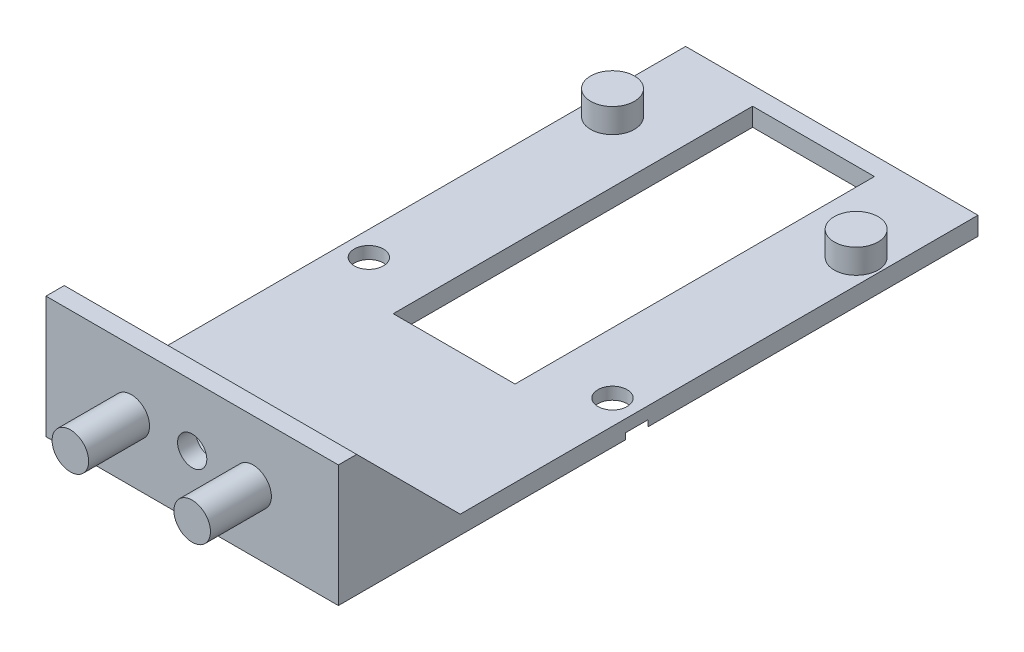
ISO-10303-21;
HEADER;
FILE_DESCRIPTION(('STEP AP214'),'2;1');
FILE_NAME('part.step','',(''),(''),'','','');
FILE_SCHEMA(('AUTOMOTIVE_DESIGN { 1 0 10303 214 1 1 1 1 }'));
ENDSEC;
DATA;
#1=APPLICATION_CONTEXT('core data for automotive mechanical design processes');
#2=APPLICATION_PROTOCOL_DEFINITION('international standard','automotive_design',2000,#1);
#3=PRODUCT_CONTEXT('',#1,'mechanical');
#4=PRODUCT('Part','Part','',(#3));
#5=PRODUCT_RELATED_PRODUCT_CATEGORY('part','',(#4));
#6=PRODUCT_DEFINITION_FORMATION('','',#4);
#7=PRODUCT_DEFINITION_CONTEXT('part definition',#1,'design');
#8=PRODUCT_DEFINITION('design','',#6,#7);
#9=PRODUCT_DEFINITION_SHAPE('','',#8);
#10=(LENGTH_UNIT() NAMED_UNIT(*) SI_UNIT(.MILLI.,.METRE.));
#11=(NAMED_UNIT(*) PLANE_ANGLE_UNIT() SI_UNIT($,.RADIAN.));
#12=(NAMED_UNIT(*) SI_UNIT($,.STERADIAN.) SOLID_ANGLE_UNIT());
#13=UNCERTAINTY_MEASURE_WITH_UNIT(LENGTH_MEASURE(1.E-05),#10,'distance_accuracy_value','');
#14=(GEOMETRIC_REPRESENTATION_CONTEXT(3) GLOBAL_UNCERTAINTY_ASSIGNED_CONTEXT((#13)) GLOBAL_UNIT_ASSIGNED_CONTEXT((#10,
#11,#12)) REPRESENTATION_CONTEXT('',''));
#15=CARTESIAN_POINT('',(0.,0.,0.));
#16=DIRECTION('',(0.,0.,1.));
#17=DIRECTION('',(1.,0.,0.));
#18=AXIS2_PLACEMENT_3D('',#15,#16,#17);
#19=CARTESIAN_POINT('',(12.,10.,32.));
#20=DIRECTION('',(0.,0.,1.));
#21=DIRECTION('',(1.,0.,0.));
#22=AXIS2_PLACEMENT_3D('',#19,#20,#21);
#23=PLANE('',#22);
#24=CARTESIAN_POINT('',(0.,5.,32.));
#25=DIRECTION('',(0.,0.,1.));
#26=DIRECTION('',(1.,0.,0.));
#27=AXIS2_PLACEMENT_3D('',#24,#25,#26);
#28=CIRCLE('',#27,1.2);
#29=CARTESIAN_POINT('',(1.2,5.,32.));
#30=VERTEX_POINT('',#29);
#31=EDGE_CURVE('E38',#30,#30,#28,.T.);
#32=ORIENTED_EDGE('',*,*,#31,.T.);
#33=EDGE_LOOP('',(#32));
#34=FACE_BOUND('',#33,.T.);
#35=DIRECTION('',(0.,1.,0.));
#36=VECTOR('',#35,1.);
#37=CARTESIAN_POINT('',(11.,10.,32.));
#38=LINE('',#37,#36);
#39=CARTESIAN_POINT('',(11.,1.5,32.));
#40=VERTEX_POINT('',#39);
#41=CARTESIAN_POINT('',(11.,10.,32.));
#42=VERTEX_POINT('',#41);
#43=EDGE_CURVE('E165',#40,#42,#38,.T.);
#44=ORIENTED_EDGE('',*,*,#43,.F.);
#45=DIRECTION('',(-1.,0.,0.));
#46=VECTOR('',#45,1.);
#47=CARTESIAN_POINT('',(12.,1.5,32.));
#48=LINE('',#47,#46);
#49=CARTESIAN_POINT('',(-11.,1.5,32.));
#50=VERTEX_POINT('',#49);
#51=EDGE_CURVE('E171',#40,#50,#48,.T.);
#52=ORIENTED_EDGE('',*,*,#51,.T.);
#53=DIRECTION('',(0.,-1.,0.));
#54=VECTOR('',#53,1.);
#55=CARTESIAN_POINT('',(-11.,10.,32.));
#56=LINE('',#55,#54);
#57=CARTESIAN_POINT('',(-11.,10.,32.));
#58=VERTEX_POINT('',#57);
#59=EDGE_CURVE('E178',#58,#50,#56,.T.);
#60=ORIENTED_EDGE('',*,*,#59,.F.);
#61=DIRECTION('',(-1.,0.,0.));
#62=VECTOR('',#61,1.);
#63=CARTESIAN_POINT('',(12.,10.,32.));
#64=LINE('',#63,#62);
#65=EDGE_CURVE('E211',#42,#58,#64,.T.);
#66=ORIENTED_EDGE('',*,*,#65,.F.);
#67=EDGE_LOOP('',(#44,#52,#60,#66));
#68=FACE_BOUND('',#67,.T.);
#69=ADVANCED_FACE('F34',(#34,#68),#23,.F.);
#70=CARTESIAN_POINT('',(0.,1.5,0.));
#71=DIRECTION('',(0.,-1.,0.));
#72=DIRECTION('',(0.,0.,-1.));
#73=AXIS2_PLACEMENT_3D('',#70,#71,#72);
#74=PLANE('',#73);
#75=DIRECTION('',(0.,0.,-1.));
#76=VECTOR('',#75,1.);
#77=CARTESIAN_POINT('',(5.,1.5,12.));
#78=LINE('',#77,#76);
#79=CARTESIAN_POINT('',(5.,1.5,12.));
#80=VERTEX_POINT('',#79);
#81=CARTESIAN_POINT('',(5.,1.5,-17.5));
#82=VERTEX_POINT('',#81);
#83=EDGE_CURVE('E258',#80,#82,#78,.T.);
#84=ORIENTED_EDGE('',*,*,#83,.F.);
#85=DIRECTION('',(1.,0.,0.));
#86=VECTOR('',#85,1.);
#87=CARTESIAN_POINT('',(-5.,1.5,12.));
#88=LINE('',#87,#86);
#89=CARTESIAN_POINT('',(-5.,1.5,12.));
#90=VERTEX_POINT('',#89);
#91=EDGE_CURVE('E266',#90,#80,#88,.T.);
#92=ORIENTED_EDGE('',*,*,#91,.F.);
#93=DIRECTION('',(0.,0.,1.));
#94=VECTOR('',#93,1.);
#95=CARTESIAN_POINT('',(-5.,1.5,12.));
#96=LINE('',#95,#94);
#97=CARTESIAN_POINT('',(-5.,1.5,-17.5));
#98=VERTEX_POINT('',#97);
#99=EDGE_CURVE('E263',#98,#90,#96,.T.);
#100=ORIENTED_EDGE('',*,*,#99,.F.);
#101=DIRECTION('',(-1.,0.,0.));
#102=VECTOR('',#101,1.);
#103=CARTESIAN_POINT('',(-5.,1.5,-17.5));
#104=LINE('',#103,#102);
#105=EDGE_CURVE('E260',#82,#98,#104,.T.);
#106=ORIENTED_EDGE('',*,*,#105,.F.);
#107=EDGE_LOOP('',(#84,#92,#100,#106));
#108=FACE_BOUND('',#107,.T.);
#109=CARTESIAN_POINT('',(10.,1.5,8.99999999999999));
#110=DIRECTION('',(0.,1.,0.));
#111=DIRECTION('',(0.,0.,1.));
#112=AXIS2_PLACEMENT_3D('',#109,#110,#111);
#113=CIRCLE('',#112,1.2);
#114=CARTESIAN_POINT('',(10.,1.5,10.2));
#115=VERTEX_POINT('',#114);
#116=EDGE_CURVE('E254',#115,#115,#113,.T.);
#117=ORIENTED_EDGE('',*,*,#116,.F.);
#118=EDGE_LOOP('',(#117));
#119=FACE_BOUND('',#118,.T.);
#120=CARTESIAN_POINT('',(10.,1.5,-11.));
#121=DIRECTION('',(0.,-1.,0.));
#122=DIRECTION('',(0.,0.,-1.));
#123=AXIS2_PLACEMENT_3D('',#120,#121,#122);
#124=CIRCLE('',#123,1.8);
#125=CARTESIAN_POINT('',(10.,1.5,-12.8));
#126=VERTEX_POINT('',#125);
#127=EDGE_CURVE('E310',#126,#126,#124,.F.);
#128=ORIENTED_EDGE('',*,*,#127,.F.);
#129=EDGE_LOOP('',(#128));
#130=FACE_BOUND('',#129,.T.);
#131=CARTESIAN_POINT('',(-10.,1.5,8.99999999999999));
#132=DIRECTION('',(0.,-1.,0.));
#133=DIRECTION('',(0.,0.,1.));
#134=AXIS2_PLACEMENT_3D('',#131,#132,#133);
#135=CIRCLE('',#134,1.2);
#136=CARTESIAN_POINT('',(-10.,1.5,10.2));
#137=VERTEX_POINT('',#136);
#138=EDGE_CURVE('E236',#137,#137,#135,.T.);
#139=ORIENTED_EDGE('',*,*,#138,.T.);
#140=EDGE_LOOP('',(#139));
#141=FACE_BOUND('',#140,.T.);
#142=CARTESIAN_POINT('',(-10.,1.5,-11.));
#143=DIRECTION('',(0.,-1.,0.));
#144=DIRECTION('',(0.,0.,1.));
#145=AXIS2_PLACEMENT_3D('',#142,#143,#144);
#146=CIRCLE('',#145,1.8);
#147=CARTESIAN_POINT('',(-10.,1.5,-9.20000000000001));
#148=VERTEX_POINT('',#147);
#149=EDGE_CURVE('E232',#148,#148,#146,.T.);
#150=ORIENTED_EDGE('',*,*,#149,.T.);
#151=EDGE_LOOP('',(#150));
#152=FACE_BOUND('',#151,.T.);
#153=DIRECTION('',(0.,0.,1.));
#154=VECTOR('',#153,1.);
#155=CARTESIAN_POINT('',(11.,1.5,0.));
#156=LINE('',#155,#154);
#157=CARTESIAN_POINT('',(11.,1.5,23.5));
#158=VERTEX_POINT('',#157);
#159=EDGE_CURVE('E160',#158,#40,#156,.T.);
#160=ORIENTED_EDGE('',*,*,#159,.F.);
#161=DIRECTION('',(-1.,0.,0.));
#162=VECTOR('',#161,1.);
#163=CARTESIAN_POINT('',(0.,1.5,23.5));
#164=LINE('',#163,#162);
#165=CARTESIAN_POINT('',(12.,1.5,23.5));
#166=VERTEX_POINT('',#165);
#167=EDGE_CURVE('E152',#158,#166,#164,.F.);
#168=ORIENTED_EDGE('',*,*,#167,.T.);
#169=DIRECTION('',(0.,0.,-1.));
#170=VECTOR('',#169,1.);
#171=CARTESIAN_POINT('',(12.,1.5,19.));
#172=LINE('',#171,#170);
#173=CARTESIAN_POINT('',(12.,1.5,-19.));
#174=VERTEX_POINT('',#173);
#175=EDGE_CURVE('E289',#166,#174,#172,.T.);
#176=ORIENTED_EDGE('',*,*,#175,.T.);
#177=DIRECTION('',(-1.,0.,0.));
#178=VECTOR('',#177,1.);
#179=CARTESIAN_POINT('',(-12.,1.5,-19.));
#180=LINE('',#179,#178);
#181=CARTESIAN_POINT('',(-12.,1.5,-19.));
#182=VERTEX_POINT('',#181);
#183=EDGE_CURVE('E291',#174,#182,#180,.T.);
#184=ORIENTED_EDGE('',*,*,#183,.T.);
#185=DIRECTION('',(0.,0.,1.));
#186=VECTOR('',#185,1.);
#187=CARTESIAN_POINT('',(-12.,1.5,19.));
#188=LINE('',#187,#186);
#189=CARTESIAN_POINT('',(-12.,1.5,23.5));
#190=VERTEX_POINT('',#189);
#191=EDGE_CURVE('E294',#182,#190,#188,.T.);
#192=ORIENTED_EDGE('',*,*,#191,.T.);
#193=DIRECTION('',(1.,0.,0.));
#194=VECTOR('',#193,1.);
#195=CARTESIAN_POINT('',(0.,1.5,23.5));
#196=LINE('',#195,#194);
#197=CARTESIAN_POINT('',(-11.,1.5,23.5));
#198=VERTEX_POINT('',#197);
#199=EDGE_CURVE('E185',#190,#198,#196,.T.);
#200=ORIENTED_EDGE('',*,*,#199,.T.);
#201=DIRECTION('',(0.,0.,-1.));
#202=VECTOR('',#201,1.);
#203=CARTESIAN_POINT('',(-11.,1.5,0.));
#204=LINE('',#203,#202);
#205=EDGE_CURVE('E183',#50,#198,#204,.T.);
#206=ORIENTED_EDGE('',*,*,#205,.F.);
#207=ORIENTED_EDGE('',*,*,#51,.F.);
#208=EDGE_LOOP('',(#160,#168,#176,#184,#192,#200,#206,#207));
#209=FACE_BOUND('',#208,.T.);
#210=ADVANCED_FACE('F169',(#108,#119,#130,#141,#152,#209),#74,.F.);
#211=CARTESIAN_POINT('',(12.,1.5,19.));
#212=DIRECTION('',(-1.,0.,0.));
#213=DIRECTION('',(0.,0.,1.));
#214=AXIS2_PLACEMENT_3D('',#211,#212,#213);
#215=PLANE('',#214);
#216=ORIENTED_EDGE('',*,*,#175,.F.);
#217=DIRECTION('',(0.,-0.707106781186546,-0.707106781186549));
#218=VECTOR('',#217,1.);
#219=CARTESIAN_POINT('',(12.,10.,32.));
#220=LINE('',#219,#218);
#221=CARTESIAN_POINT('',(12.,10.,32.));
#222=VERTEX_POINT('',#221);
#223=EDGE_CURVE('E155',#222,#166,#220,.T.);
#224=ORIENTED_EDGE('',*,*,#223,.F.);
#225=DIRECTION('',(0.,0.,-1.));
#226=VECTOR('',#225,1.);
#227=CARTESIAN_POINT('',(12.,10.,33.5));
#228=LINE('',#227,#226);
#229=CARTESIAN_POINT('',(12.,10.,33.5));
#230=VERTEX_POINT('',#229);
#231=EDGE_CURVE('E203',#230,#222,#228,.T.);
#232=ORIENTED_EDGE('',*,*,#231,.F.);
#233=DIRECTION('',(0.,-1.,0.));
#234=VECTOR('',#233,1.);
#235=CARTESIAN_POINT('',(12.,29.5401497856199,33.5));
#236=LINE('',#235,#234);
#237=CARTESIAN_POINT('',(12.,0.,33.5));
#238=VERTEX_POINT('',#237);
#239=EDGE_CURVE('E219',#230,#238,#236,.T.);
#240=ORIENTED_EDGE('',*,*,#239,.T.);
#241=DIRECTION('',(0.,0.,-1.));
#242=VECTOR('',#241,1.);
#243=CARTESIAN_POINT('',(12.,0.,19.));
#244=LINE('',#243,#242);
#245=CARTESIAN_POINT('',(12.,0.,9.91651513899116));
#246=VERTEX_POINT('',#245);
#247=EDGE_CURVE('E298',#238,#246,#244,.T.);
#248=ORIENTED_EDGE('',*,*,#247,.T.);
#249=DIRECTION('',(0.,-1.,0.));
#250=VECTOR('',#249,1.);
#251=CARTESIAN_POINT('',(12.,0.5,9.91651513899116));
#252=LINE('',#251,#250);
#253=CARTESIAN_POINT('',(12.,0.5,9.91651513899116));
#254=VERTEX_POINT('',#253);
#255=EDGE_CURVE('E313',#254,#246,#252,.T.);
#256=ORIENTED_EDGE('',*,*,#255,.F.);
#257=DIRECTION('',(0.,0.,-1.));
#258=VECTOR('',#257,1.);
#259=CARTESIAN_POINT('',(12.,0.5,19.));
#260=LINE('',#259,#258);
#261=CARTESIAN_POINT('',(12.,0.5,8.08348486100883));
#262=VERTEX_POINT('',#261);
#263=EDGE_CURVE('E248',#254,#262,#260,.T.);
#264=ORIENTED_EDGE('',*,*,#263,.T.);
#265=DIRECTION('',(0.,-1.,0.));
#266=VECTOR('',#265,1.);
#267=CARTESIAN_POINT('',(12.,0.5,8.08348486100883));
#268=LINE('',#267,#266);
#269=CARTESIAN_POINT('',(12.,0.,8.08348486100883));
#270=VERTEX_POINT('',#269);
#271=EDGE_CURVE('E318',#270,#262,#268,.F.);
#272=ORIENTED_EDGE('',*,*,#271,.F.);
#273=CARTESIAN_POINT('',(12.,0.,-19.));
#274=VERTEX_POINT('',#273);
#275=EDGE_CURVE('E288',#270,#274,#244,.T.);
#276=ORIENTED_EDGE('',*,*,#275,.T.);
#277=DIRECTION('',(0.,-1.,0.));
#278=VECTOR('',#277,1.);
#279=CARTESIAN_POINT('',(12.,1.5,-19.));
#280=LINE('',#279,#278);
#281=EDGE_CURVE('E307',#174,#274,#280,.T.);
#282=ORIENTED_EDGE('',*,*,#281,.F.);
#283=EDGE_LOOP('',(#216,#224,#232,#240,#248,#256,#264,#272,#276,#282));
#284=FACE_BOUND('',#283,.T.);
#285=ADVANCED_FACE('F36',(#284),#215,.F.);
#286=CARTESIAN_POINT('',(0.,0.,0.));
#287=DIRECTION('',(0.,-1.,0.));
#288=DIRECTION('',(0.,0.,-1.));
#289=AXIS2_PLACEMENT_3D('',#286,#287,#288);
#290=PLANE('',#289);
#291=CARTESIAN_POINT('',(10.,0.,8.99999999999999));
#292=DIRECTION('',(0.,1.,0.));
#293=DIRECTION('',(0.,0.,1.));
#294=AXIS2_PLACEMENT_3D('',#291,#292,#293);
#295=CIRCLE('',#294,2.2);
#296=EDGE_CURVE('E241',#270,#246,#295,.T.);
#297=ORIENTED_EDGE('',*,*,#296,.T.);
#298=ORIENTED_EDGE('',*,*,#247,.F.);
#299=DIRECTION('',(-1.,0.,0.));
#300=VECTOR('',#299,1.);
#301=CARTESIAN_POINT('',(12.,0.,33.5));
#302=LINE('',#301,#300);
#303=CARTESIAN_POINT('',(-12.,0.,33.5));
#304=VERTEX_POINT('',#303);
#305=EDGE_CURVE('E216',#238,#304,#302,.T.);
#306=ORIENTED_EDGE('',*,*,#305,.T.);
#307=DIRECTION('',(0.,0.,1.));
#308=VECTOR('',#307,1.);
#309=CARTESIAN_POINT('',(-12.,0.,19.));
#310=LINE('',#309,#308);
#311=CARTESIAN_POINT('',(-12.,0.,9.91651513899117));
#312=VERTEX_POINT('',#311);
#313=EDGE_CURVE('E302',#312,#304,#310,.T.);
#314=ORIENTED_EDGE('',*,*,#313,.F.);
#315=CARTESIAN_POINT('',(-10.,0.,8.99999999999999));
#316=DIRECTION('',(0.,-1.,0.));
#317=DIRECTION('',(0.,0.,1.));
#318=AXIS2_PLACEMENT_3D('',#315,#316,#317);
#319=CIRCLE('',#318,2.2);
#320=CARTESIAN_POINT('',(-12.,0.,8.08348486100881));
#321=VERTEX_POINT('',#320);
#322=EDGE_CURVE('E223',#321,#312,#319,.T.);
#323=ORIENTED_EDGE('',*,*,#322,.F.);
#324=CARTESIAN_POINT('',(-12.,0.,-19.));
#325=VERTEX_POINT('',#324);
#326=EDGE_CURVE('E292',#325,#321,#310,.T.);
#327=ORIENTED_EDGE('',*,*,#326,.F.);
#328=DIRECTION('',(-1.,0.,0.));
#329=VECTOR('',#328,1.);
#330=CARTESIAN_POINT('',(-12.,0.,-19.));
#331=LINE('',#330,#329);
#332=EDGE_CURVE('E300',#274,#325,#331,.T.);
#333=ORIENTED_EDGE('',*,*,#332,.F.);
#334=ORIENTED_EDGE('',*,*,#275,.F.);
#335=EDGE_LOOP('',(#297,#298,#306,#314,#323,#327,#333,#334));
#336=FACE_BOUND('',#335,.T.);
#337=DIRECTION('',(1.,0.,0.));
#338=VECTOR('',#337,1.);
#339=CARTESIAN_POINT('',(-5.,0.,12.));
#340=LINE('',#339,#338);
#341=CARTESIAN_POINT('',(-5.,0.,12.));
#342=VERTEX_POINT('',#341);
#343=CARTESIAN_POINT('',(5.,0.,12.));
#344=VERTEX_POINT('',#343);
#345=EDGE_CURVE('E261',#342,#344,#340,.T.);
#346=ORIENTED_EDGE('',*,*,#345,.T.);
#347=DIRECTION('',(0.,0.,-1.));
#348=VECTOR('',#347,1.);
#349=CARTESIAN_POINT('',(5.,0.,12.));
#350=LINE('',#349,#348);
#351=CARTESIAN_POINT('',(5.,0.,-17.5));
#352=VERTEX_POINT('',#351);
#353=EDGE_CURVE('E257',#344,#352,#350,.T.);
#354=ORIENTED_EDGE('',*,*,#353,.T.);
#355=DIRECTION('',(-1.,0.,0.));
#356=VECTOR('',#355,1.);
#357=CARTESIAN_POINT('',(-5.,0.,-17.5));
#358=LINE('',#357,#356);
#359=CARTESIAN_POINT('',(-5.,0.,-17.5));
#360=VERTEX_POINT('',#359);
#361=EDGE_CURVE('E271',#352,#360,#358,.T.);
#362=ORIENTED_EDGE('',*,*,#361,.T.);
#363=DIRECTION('',(0.,0.,1.));
#364=VECTOR('',#363,1.);
#365=CARTESIAN_POINT('',(-5.,0.,12.));
#366=LINE('',#365,#364);
#367=EDGE_CURVE('E274',#360,#342,#366,.T.);
#368=ORIENTED_EDGE('',*,*,#367,.T.);
#369=EDGE_LOOP('',(#346,#354,#362,#368));
#370=FACE_BOUND('',#369,.T.);
#371=ADVANCED_FACE('F332',(#336,#370),#290,.T.);
#372=CARTESIAN_POINT('',(-12.,1.5,-19.));
#373=DIRECTION('',(0.,0.,1.));
#374=DIRECTION('',(1.,0.,0.));
#375=AXIS2_PLACEMENT_3D('',#372,#373,#374);
#376=PLANE('',#375);
#377=ORIENTED_EDGE('',*,*,#332,.T.);
#378=DIRECTION('',(0.,-1.,0.));
#379=VECTOR('',#378,1.);
#380=CARTESIAN_POINT('',(-12.,1.5,-19.));
#381=LINE('',#380,#379);
#382=EDGE_CURVE('E297',#182,#325,#381,.T.);
#383=ORIENTED_EDGE('',*,*,#382,.F.);
#384=ORIENTED_EDGE('',*,*,#183,.F.);
#385=ORIENTED_EDGE('',*,*,#281,.T.);
#386=EDGE_LOOP('',(#377,#383,#384,#385));
#387=FACE_BOUND('',#386,.T.);
#388=ADVANCED_FACE('F354',(#387),#376,.F.);
#389=CARTESIAN_POINT('',(-12.,1.5,19.));
#390=DIRECTION('',(1.,0.,0.));
#391=DIRECTION('',(0.,0.,-1.));
#392=AXIS2_PLACEMENT_3D('',#389,#390,#391);
#393=PLANE('',#392);
#394=DIRECTION('',(0.,-0.707106781186546,-0.707106781186549));
#395=VECTOR('',#394,1.);
#396=CARTESIAN_POINT('',(-12.,10.,32.));
#397=LINE('',#396,#395);
#398=CARTESIAN_POINT('',(-12.,10.,32.));
#399=VERTEX_POINT('',#398);
#400=EDGE_CURVE('E175',#399,#190,#397,.T.);
#401=ORIENTED_EDGE('',*,*,#400,.T.);
#402=ORIENTED_EDGE('',*,*,#191,.F.);
#403=ORIENTED_EDGE('',*,*,#382,.T.);
#404=ORIENTED_EDGE('',*,*,#326,.T.);
#405=DIRECTION('',(0.,-1.,0.));
#406=VECTOR('',#405,1.);
#407=CARTESIAN_POINT('',(-12.,0.5,8.08348486100881));
#408=LINE('',#407,#406);
#409=CARTESIAN_POINT('',(-12.,0.5,8.08348486100881));
#410=VERTEX_POINT('',#409);
#411=EDGE_CURVE('E43',#321,#410,#408,.F.);
#412=ORIENTED_EDGE('',*,*,#411,.T.);
#413=DIRECTION('',(0.,0.,1.));
#414=VECTOR('',#413,1.);
#415=CARTESIAN_POINT('',(-12.,0.5,19.));
#416=LINE('',#415,#414);
#417=CARTESIAN_POINT('',(-12.,0.5,9.91651513899117));
#418=VERTEX_POINT('',#417);
#419=EDGE_CURVE('E229',#410,#418,#416,.T.);
#420=ORIENTED_EDGE('',*,*,#419,.T.);
#421=DIRECTION('',(0.,-1.,0.));
#422=VECTOR('',#421,1.);
#423=CARTESIAN_POINT('',(-12.,0.5,9.91651513899117));
#424=LINE('',#423,#422);
#425=EDGE_CURVE('E11',#418,#312,#424,.T.);
#426=ORIENTED_EDGE('',*,*,#425,.T.);
#427=ORIENTED_EDGE('',*,*,#313,.T.);
#428=DIRECTION('',(0.,-1.,0.));
#429=VECTOR('',#428,1.);
#430=CARTESIAN_POINT('',(-12.,29.5401497856199,33.5));
#431=LINE('',#430,#429);
#432=CARTESIAN_POINT('',(-12.,10.,33.5));
#433=VERTEX_POINT('',#432);
#434=EDGE_CURVE('E220',#433,#304,#431,.T.);
#435=ORIENTED_EDGE('',*,*,#434,.F.);
#436=DIRECTION('',(0.,0.,1.));
#437=VECTOR('',#436,1.);
#438=CARTESIAN_POINT('',(-12.,10.,33.5));
#439=LINE('',#438,#437);
#440=EDGE_CURVE('E210',#399,#433,#439,.T.);
#441=ORIENTED_EDGE('',*,*,#440,.F.);
#442=EDGE_LOOP('',(#401,#402,#403,#404,#412,#420,#426,#427,#435,#441));
#443=FACE_BOUND('',#442,.T.);
#444=ADVANCED_FACE('F325',(#443),#393,.F.);
#445=CARTESIAN_POINT('',(5.,1.5,12.));
#446=DIRECTION('',(-1.,0.,0.));
#447=DIRECTION('',(0.,0.,1.));
#448=AXIS2_PLACEMENT_3D('',#445,#446,#447);
#449=PLANE('',#448);
#450=ORIENTED_EDGE('',*,*,#353,.F.);
#451=DIRECTION('',(0.,-1.,0.));
#452=VECTOR('',#451,1.);
#453=CARTESIAN_POINT('',(5.,1.5,12.));
#454=LINE('',#453,#452);
#455=EDGE_CURVE('E268',#80,#344,#454,.T.);
#456=ORIENTED_EDGE('',*,*,#455,.F.);
#457=ORIENTED_EDGE('',*,*,#83,.T.);
#458=DIRECTION('',(0.,-1.,0.));
#459=VECTOR('',#458,1.);
#460=CARTESIAN_POINT('',(5.,1.5,-17.5));
#461=LINE('',#460,#459);
#462=EDGE_CURVE('E285',#82,#352,#461,.T.);
#463=ORIENTED_EDGE('',*,*,#462,.T.);
#464=EDGE_LOOP('',(#450,#456,#457,#463));
#465=FACE_BOUND('',#464,.T.);
#466=ADVANCED_FACE('F533',(#465),#449,.T.);
#467=CARTESIAN_POINT('',(-5.,1.5,-17.5));
#468=DIRECTION('',(0.,0.,1.));
#469=DIRECTION('',(1.,0.,0.));
#470=AXIS2_PLACEMENT_3D('',#467,#468,#469);
#471=PLANE('',#470);
#472=ORIENTED_EDGE('',*,*,#361,.F.);
#473=ORIENTED_EDGE('',*,*,#462,.F.);
#474=ORIENTED_EDGE('',*,*,#105,.T.);
#475=DIRECTION('',(0.,-1.,0.));
#476=VECTOR('',#475,1.);
#477=CARTESIAN_POINT('',(-5.,1.5,-17.5));
#478=LINE('',#477,#476);
#479=EDGE_CURVE('E283',#98,#360,#478,.T.);
#480=ORIENTED_EDGE('',*,*,#479,.T.);
#481=EDGE_LOOP('',(#472,#473,#474,#480));
#482=FACE_BOUND('',#481,.T.);
#483=ADVANCED_FACE('F582',(#482),#471,.T.);
#484=CARTESIAN_POINT('',(-5.,1.5,12.));
#485=DIRECTION('',(1.,0.,0.));
#486=DIRECTION('',(0.,0.,-1.));
#487=AXIS2_PLACEMENT_3D('',#484,#485,#486);
#488=PLANE('',#487);
#489=ORIENTED_EDGE('',*,*,#367,.F.);
#490=ORIENTED_EDGE('',*,*,#479,.F.);
#491=ORIENTED_EDGE('',*,*,#99,.T.);
#492=DIRECTION('',(0.,-1.,0.));
#493=VECTOR('',#492,1.);
#494=CARTESIAN_POINT('',(-5.,1.5,12.));
#495=LINE('',#494,#493);
#496=EDGE_CURVE('E281',#90,#342,#495,.T.);
#497=ORIENTED_EDGE('',*,*,#496,.T.);
#498=EDGE_LOOP('',(#489,#490,#491,#497));
#499=FACE_BOUND('',#498,.T.);
#500=ADVANCED_FACE('F590',(#499),#488,.T.);
#501=CARTESIAN_POINT('',(-5.,1.5,12.));
#502=DIRECTION('',(0.,0.,-1.));
#503=DIRECTION('',(-1.,0.,0.));
#504=AXIS2_PLACEMENT_3D('',#501,#502,#503);
#505=PLANE('',#504);
#506=ORIENTED_EDGE('',*,*,#345,.F.);
#507=ORIENTED_EDGE('',*,*,#496,.F.);
#508=ORIENTED_EDGE('',*,*,#91,.T.);
#509=ORIENTED_EDGE('',*,*,#455,.T.);
#510=EDGE_LOOP('',(#506,#507,#508,#509));
#511=FACE_BOUND('',#510,.T.);
#512=ADVANCED_FACE('F598',(#511),#505,.T.);
#513=CARTESIAN_POINT('',(10.,0.,8.99999999999999));
#514=DIRECTION('',(0.,1.,0.));
#515=DIRECTION('',(0.,0.,1.));
#516=AXIS2_PLACEMENT_3D('',#513,#514,#515);
#517=CYLINDRICAL_SURFACE('',#516,1.2);
#518=CARTESIAN_POINT('',(10.,0.5,8.99999999999999));
#519=DIRECTION('',(0.,1.,0.));
#520=DIRECTION('',(0.,0.,1.));
#521=AXIS2_PLACEMENT_3D('',#518,#519,#520);
#522=CIRCLE('',#521,1.2);
#523=CARTESIAN_POINT('',(10.,0.5,10.2));
#524=VERTEX_POINT('',#523);
#525=EDGE_CURVE('E245',#524,#524,#522,.F.);
#526=ORIENTED_EDGE('',*,*,#525,.T.);
#527=EDGE_LOOP('',(#526));
#528=FACE_BOUND('',#527,.T.);
#529=ORIENTED_EDGE('',*,*,#116,.T.);
#530=EDGE_LOOP('',(#529));
#531=FACE_BOUND('',#530,.T.);
#532=ADVANCED_FACE('F606',(#528,#531),#517,.F.);
#533=CARTESIAN_POINT('',(10.,3.5,-11.));
#534=DIRECTION('',(0.,-1.,0.));
#535=DIRECTION('',(0.,0.,-1.));
#536=AXIS2_PLACEMENT_3D('',#533,#534,#535);
#537=CYLINDRICAL_SURFACE('',#536,1.8);
#538=CARTESIAN_POINT('',(10.,3.5,-11.));
#539=DIRECTION('',(0.,1.,0.));
#540=DIRECTION('',(0.,0.,1.));
#541=AXIS2_PLACEMENT_3D('',#538,#539,#540);
#542=CIRCLE('',#541,1.8);
#543=CARTESIAN_POINT('',(10.,3.5,-9.20000000000001));
#544=VERTEX_POINT('',#543);
#545=EDGE_CURVE('E251',#544,#544,#542,.T.);
#546=ORIENTED_EDGE('',*,*,#545,.F.);
#547=EDGE_LOOP('',(#546));
#548=FACE_BOUND('',#547,.T.);
#549=ORIENTED_EDGE('',*,*,#127,.T.);
#550=EDGE_LOOP('',(#549));
#551=FACE_BOUND('',#550,.T.);
#552=ADVANCED_FACE('F615',(#548,#551),#537,.T.);
#553=CARTESIAN_POINT('',(0.,3.5,0.));
#554=DIRECTION('',(0.,1.,0.));
#555=DIRECTION('',(0.,0.,1.));
#556=AXIS2_PLACEMENT_3D('',#553,#554,#555);
#557=PLANE('',#556);
#558=ORIENTED_EDGE('',*,*,#545,.T.);
#559=EDGE_LOOP('',(#558));
#560=FACE_BOUND('',#559,.T.);
#561=ADVANCED_FACE('F375',(#560),#557,.T.);
#562=CARTESIAN_POINT('',(10.,0.5,8.99999999999999));
#563=DIRECTION('',(0.,-1.,0.));
#564=DIRECTION('',(0.,0.,-1.));
#565=AXIS2_PLACEMENT_3D('',#562,#563,#564);
#566=CYLINDRICAL_SURFACE('',#565,2.2);
#567=ORIENTED_EDGE('',*,*,#271,.T.);
#568=CARTESIAN_POINT('',(10.,0.5,8.99999999999999));
#569=DIRECTION('',(0.,1.,0.));
#570=DIRECTION('',(0.,0.,1.));
#571=AXIS2_PLACEMENT_3D('',#568,#569,#570);
#572=CIRCLE('',#571,2.2);
#573=EDGE_CURVE('E242',#262,#254,#572,.T.);
#574=ORIENTED_EDGE('',*,*,#573,.T.);
#575=ORIENTED_EDGE('',*,*,#255,.T.);
#576=ORIENTED_EDGE('',*,*,#296,.F.);
#577=EDGE_LOOP('',(#567,#574,#575,#576));
#578=FACE_BOUND('',#577,.T.);
#579=ADVANCED_FACE('F360',(#578),#566,.F.);
#580=CARTESIAN_POINT('',(10.,0.5,8.99999999999999));
#581=DIRECTION('',(0.,1.,0.));
#582=DIRECTION('',(0.,0.,1.));
#583=AXIS2_PLACEMENT_3D('',#580,#581,#582);
#584=PLANE('',#583);
#585=ORIENTED_EDGE('',*,*,#525,.F.);
#586=EDGE_LOOP('',(#585));
#587=FACE_BOUND('',#586,.T.);
#588=ORIENTED_EDGE('',*,*,#573,.F.);
#589=ORIENTED_EDGE('',*,*,#263,.F.);
#590=EDGE_LOOP('',(#588,#589));
#591=FACE_BOUND('',#590,.T.);
#592=ADVANCED_FACE('F363',(#587,#591),#584,.F.);
#593=CARTESIAN_POINT('',(-10.,0.,8.99999999999999));
#594=DIRECTION('',(0.,1.,0.));
#595=DIRECTION('',(0.,0.,1.));
#596=AXIS2_PLACEMENT_3D('',#593,#594,#595);
#597=CYLINDRICAL_SURFACE('',#596,1.2);
#598=CARTESIAN_POINT('',(-10.,0.5,8.99999999999999));
#599=DIRECTION('',(0.,1.,0.));
#600=DIRECTION('',(0.,0.,1.));
#601=AXIS2_PLACEMENT_3D('',#598,#599,#600);
#602=CIRCLE('',#601,1.2);
#603=CARTESIAN_POINT('',(-10.,0.5,10.2));
#604=VERTEX_POINT('',#603);
#605=EDGE_CURVE('E227',#604,#604,#602,.T.);
#606=ORIENTED_EDGE('',*,*,#605,.F.);
#607=EDGE_LOOP('',(#606));
#608=FACE_BOUND('',#607,.T.);
#609=ORIENTED_EDGE('',*,*,#138,.F.);
#610=EDGE_LOOP('',(#609));
#611=FACE_BOUND('',#610,.T.);
#612=ADVANCED_FACE('F365',(#608,#611),#597,.F.);
#613=CARTESIAN_POINT('',(-10.,3.5,-11.));
#614=DIRECTION('',(0.,-1.,0.));
#615=DIRECTION('',(0.,0.,-1.));
#616=AXIS2_PLACEMENT_3D('',#613,#614,#615);
#617=CYLINDRICAL_SURFACE('',#616,1.8);
#618=CARTESIAN_POINT('',(-10.,3.5,-11.));
#619=DIRECTION('',(0.,-1.,0.));
#620=DIRECTION('',(0.,0.,1.));
#621=AXIS2_PLACEMENT_3D('',#618,#619,#620);
#622=CIRCLE('',#621,1.8);
#623=CARTESIAN_POINT('',(-10.,3.5,-9.20000000000001));
#624=VERTEX_POINT('',#623);
#625=EDGE_CURVE('E233',#624,#624,#622,.T.);
#626=ORIENTED_EDGE('',*,*,#625,.T.);
#627=EDGE_LOOP('',(#626));
#628=FACE_BOUND('',#627,.T.);
#629=ORIENTED_EDGE('',*,*,#149,.F.);
#630=EDGE_LOOP('',(#629));
#631=FACE_BOUND('',#630,.T.);
#632=ADVANCED_FACE('F372',(#628,#631),#617,.T.);
#633=CARTESIAN_POINT('',(0.,3.5,0.));
#634=DIRECTION('',(0.,1.,0.));
#635=DIRECTION('',(0.,0.,1.));
#636=AXIS2_PLACEMENT_3D('',#633,#634,#635);
#637=PLANE('',#636);
#638=ORIENTED_EDGE('',*,*,#625,.F.);
#639=EDGE_LOOP('',(#638));
#640=FACE_BOUND('',#639,.T.);
#641=ADVANCED_FACE('F399',(#640),#637,.T.);
#642=CARTESIAN_POINT('',(-10.,0.5,8.99999999999999));
#643=DIRECTION('',(0.,-1.,0.));
#644=DIRECTION('',(0.,0.,-1.));
#645=AXIS2_PLACEMENT_3D('',#642,#643,#644);
#646=CYLINDRICAL_SURFACE('',#645,2.2);
#647=CARTESIAN_POINT('',(-10.,0.5,8.99999999999999));
#648=DIRECTION('',(0.,-1.,0.));
#649=DIRECTION('',(0.,0.,1.));
#650=AXIS2_PLACEMENT_3D('',#647,#648,#649);
#651=CIRCLE('',#650,2.2);
#652=EDGE_CURVE('E57',#410,#418,#651,.T.);
#653=ORIENTED_EDGE('',*,*,#652,.F.);
#654=ORIENTED_EDGE('',*,*,#411,.F.);
#655=ORIENTED_EDGE('',*,*,#322,.T.);
#656=ORIENTED_EDGE('',*,*,#425,.F.);
#657=EDGE_LOOP('',(#653,#654,#655,#656));
#658=FACE_BOUND('',#657,.T.);
#659=ADVANCED_FACE('F329',(#658),#646,.F.);
#660=CARTESIAN_POINT('',(-10.,0.5,8.99999999999999));
#661=DIRECTION('',(0.,1.,0.));
#662=DIRECTION('',(0.,0.,1.));
#663=AXIS2_PLACEMENT_3D('',#660,#661,#662);
#664=PLANE('',#663);
#665=ORIENTED_EDGE('',*,*,#605,.T.);
#666=EDGE_LOOP('',(#665));
#667=FACE_BOUND('',#666,.T.);
#668=ORIENTED_EDGE('',*,*,#652,.T.);
#669=ORIENTED_EDGE('',*,*,#419,.F.);
#670=EDGE_LOOP('',(#668,#669));
#671=FACE_BOUND('',#670,.T.);
#672=ADVANCED_FACE('F393',(#667,#671),#664,.F.);
#673=CARTESIAN_POINT('',(12.,29.5401497856199,33.5));
#674=DIRECTION('',(0.,0.,1.));
#675=DIRECTION('',(1.,0.,0.));
#676=AXIS2_PLACEMENT_3D('',#673,#674,#675);
#677=PLANE('',#676);
#678=ORIENTED_EDGE('',*,*,#239,.F.);
#679=DIRECTION('',(1.,0.,0.));
#680=VECTOR('',#679,1.);
#681=CARTESIAN_POINT('',(12.,10.,33.5));
#682=LINE('',#681,#680);
#683=EDGE_CURVE('E214',#433,#230,#682,.T.);
#684=ORIENTED_EDGE('',*,*,#683,.F.);
#685=ORIENTED_EDGE('',*,*,#434,.T.);
#686=ORIENTED_EDGE('',*,*,#305,.F.);
#687=EDGE_LOOP('',(#678,#684,#685,#686));
#688=FACE_BOUND('',#687,.T.);
#689=CARTESIAN_POINT('',(-5.,5.,33.5));
#690=DIRECTION('',(0.,0.,1.));
#691=DIRECTION('',(1.,0.,0.));
#692=AXIS2_PLACEMENT_3D('',#689,#690,#691);
#693=CIRCLE('',#692,1.5);
#694=CARTESIAN_POINT('',(-3.5,5.,33.5));
#695=VERTEX_POINT('',#694);
#696=EDGE_CURVE('E188',#695,#695,#693,.T.);
#697=ORIENTED_EDGE('',*,*,#696,.F.);
#698=EDGE_LOOP('',(#697));
#699=FACE_BOUND('',#698,.T.);
#700=CARTESIAN_POINT('',(5.,5.,33.5));
#701=DIRECTION('',(0.,0.,1.));
#702=DIRECTION('',(1.,0.,0.));
#703=AXIS2_PLACEMENT_3D('',#700,#701,#702);
#704=CIRCLE('',#703,1.5);
#705=CARTESIAN_POINT('',(6.5,5.,33.5));
#706=VERTEX_POINT('',#705);
#707=EDGE_CURVE('E192',#706,#706,#704,.T.);
#708=ORIENTED_EDGE('',*,*,#707,.F.);
#709=EDGE_LOOP('',(#708));
#710=FACE_BOUND('',#709,.T.);
#711=CARTESIAN_POINT('',(0.,5.,33.5));
#712=DIRECTION('',(0.,0.,1.));
#713=DIRECTION('',(1.,0.,0.));
#714=AXIS2_PLACEMENT_3D('',#711,#712,#713);
#715=CIRCLE('',#714,1.2);
#716=CARTESIAN_POINT('',(1.2,5.,33.5));
#717=VERTEX_POINT('',#716);
#718=EDGE_CURVE('E198',#717,#717,#715,.T.);
#719=ORIENTED_EDGE('',*,*,#718,.F.);
#720=EDGE_LOOP('',(#719));
#721=FACE_BOUND('',#720,.T.);
#722=ADVANCED_FACE('F341',(#688,#699,#710,#721),#677,.T.);
#723=CARTESIAN_POINT('',(0.,10.,0.));
#724=DIRECTION('',(0.,1.,0.));
#725=DIRECTION('',(0.,0.,1.));
#726=AXIS2_PLACEMENT_3D('',#723,#724,#725);
#727=PLANE('',#726);
#728=EDGE_CURVE('E207',#222,#42,#64,.T.);
#729=ORIENTED_EDGE('',*,*,#728,.T.);
#730=ORIENTED_EDGE('',*,*,#65,.T.);
#731=EDGE_CURVE('E206',#58,#399,#64,.T.);
#732=ORIENTED_EDGE('',*,*,#731,.T.);
#733=ORIENTED_EDGE('',*,*,#440,.T.);
#734=ORIENTED_EDGE('',*,*,#683,.T.);
#735=ORIENTED_EDGE('',*,*,#231,.T.);
#736=EDGE_LOOP('',(#729,#730,#732,#733,#734,#735));
#737=FACE_BOUND('',#736,.T.);
#738=ADVANCED_FACE('F345',(#737),#727,.T.);
#739=CARTESIAN_POINT('',(0.,5.,23.5));
#740=DIRECTION('',(0.,0.,1.));
#741=DIRECTION('',(1.,0.,0.));
#742=AXIS2_PLACEMENT_3D('',#739,#740,#741);
#743=CYLINDRICAL_SURFACE('',#742,1.2);
#744=ORIENTED_EDGE('',*,*,#718,.T.);
#745=EDGE_LOOP('',(#744));
#746=FACE_BOUND('',#745,.T.);
#747=ORIENTED_EDGE('',*,*,#31,.F.);
#748=EDGE_LOOP('',(#747));
#749=FACE_BOUND('',#748,.T.);
#750=ADVANCED_FACE('F437',(#746,#749),#743,.F.);
#751=CARTESIAN_POINT('',(5.,5.,38.5));
#752=DIRECTION('',(0.,0.,-1.));
#753=DIRECTION('',(-1.,0.,0.));
#754=AXIS2_PLACEMENT_3D('',#751,#752,#753);
#755=CYLINDRICAL_SURFACE('',#754,1.5);
#756=CARTESIAN_POINT('',(5.,5.,38.5));
#757=DIRECTION('',(0.,0.,1.));
#758=DIRECTION('',(1.,0.,0.));
#759=AXIS2_PLACEMENT_3D('',#756,#757,#758);
#760=CIRCLE('',#759,1.5);
#761=CARTESIAN_POINT('',(6.5,5.,38.5));
#762=VERTEX_POINT('',#761);
#763=EDGE_CURVE('E195',#762,#762,#760,.T.);
#764=ORIENTED_EDGE('',*,*,#763,.F.);
#765=EDGE_LOOP('',(#764));
#766=FACE_BOUND('',#765,.T.);
#767=ORIENTED_EDGE('',*,*,#707,.T.);
#768=EDGE_LOOP('',(#767));
#769=FACE_BOUND('',#768,.T.);
#770=ADVANCED_FACE('F443',(#766,#769),#755,.T.);
#771=CARTESIAN_POINT('',(5.,5.,38.5));
#772=DIRECTION('',(0.,0.,1.));
#773=DIRECTION('',(1.,0.,0.));
#774=AXIS2_PLACEMENT_3D('',#771,#772,#773);
#775=PLANE('',#774);
#776=ORIENTED_EDGE('',*,*,#763,.T.);
#777=EDGE_LOOP('',(#776));
#778=FACE_BOUND('',#777,.T.);
#779=ADVANCED_FACE('F450',(#778),#775,.T.);
#780=CARTESIAN_POINT('',(-5.,5.,38.5));
#781=DIRECTION('',(0.,0.,-1.));
#782=DIRECTION('',(-1.,0.,0.));
#783=AXIS2_PLACEMENT_3D('',#780,#781,#782);
#784=CYLINDRICAL_SURFACE('',#783,1.5);
#785=CARTESIAN_POINT('',(-5.,5.,38.5));
#786=DIRECTION('',(0.,0.,1.));
#787=DIRECTION('',(1.,0.,0.));
#788=AXIS2_PLACEMENT_3D('',#785,#786,#787);
#789=CIRCLE('',#788,1.5);
#790=CARTESIAN_POINT('',(-3.5,5.,38.5));
#791=VERTEX_POINT('',#790);
#792=EDGE_CURVE('E189',#791,#791,#789,.T.);
#793=ORIENTED_EDGE('',*,*,#792,.F.);
#794=EDGE_LOOP('',(#793));
#795=FACE_BOUND('',#794,.T.);
#796=ORIENTED_EDGE('',*,*,#696,.T.);
#797=EDGE_LOOP('',(#796));
#798=FACE_BOUND('',#797,.T.);
#799=ADVANCED_FACE('F458',(#795,#798),#784,.T.);
#800=CARTESIAN_POINT('',(-5.,5.,38.5));
#801=DIRECTION('',(0.,0.,1.));
#802=DIRECTION('',(1.,0.,0.));
#803=AXIS2_PLACEMENT_3D('',#800,#801,#802);
#804=PLANE('',#803);
#805=ORIENTED_EDGE('',*,*,#792,.T.);
#806=EDGE_LOOP('',(#805));
#807=FACE_BOUND('',#806,.T.);
#808=ADVANCED_FACE('F466',(#807),#804,.T.);
#809=CARTESIAN_POINT('',(-12.,10.,32.));
#810=DIRECTION('',(0.,0.707106781186549,-0.707106781186546));
#811=DIRECTION('',(0.,-0.707106781186546,-0.707106781186549));
#812=AXIS2_PLACEMENT_3D('',#809,#810,#811);
#813=PLANE('',#812);
#814=ORIENTED_EDGE('',*,*,#199,.F.);
#815=ORIENTED_EDGE('',*,*,#400,.F.);
#816=ORIENTED_EDGE('',*,*,#731,.F.);
#817=DIRECTION('',(0.,-0.707106781186546,-0.707106781186549));
#818=VECTOR('',#817,1.);
#819=CARTESIAN_POINT('',(-11.,10.,32.));
#820=LINE('',#819,#818);
#821=EDGE_CURVE('E159',#58,#198,#820,.T.);
#822=ORIENTED_EDGE('',*,*,#821,.T.);
#823=EDGE_LOOP('',(#814,#815,#816,#822));
#824=FACE_BOUND('',#823,.T.);
#825=ADVANCED_FACE('F474',(#824),#813,.T.);
#826=CARTESIAN_POINT('',(-11.,5.,9.74999999999999));
#827=DIRECTION('',(-1.,0.,0.));
#828=DIRECTION('',(0.,0.,1.));
#829=AXIS2_PLACEMENT_3D('',#826,#827,#828);
#830=PLANE('',#829);
#831=ORIENTED_EDGE('',*,*,#59,.T.);
#832=ORIENTED_EDGE('',*,*,#205,.T.);
#833=ORIENTED_EDGE('',*,*,#821,.F.);
#834=EDGE_LOOP('',(#831,#832,#833));
#835=FACE_BOUND('',#834,.T.);
#836=ADVANCED_FACE('F483',(#835),#830,.F.);
#837=CARTESIAN_POINT('',(12.,10.,32.));
#838=DIRECTION('',(0.,-0.707106781186549,0.707106781186546));
#839=DIRECTION('',(0.,-0.707106781186546,-0.707106781186549));
#840=AXIS2_PLACEMENT_3D('',#837,#838,#839);
#841=PLANE('',#840);
#842=ORIENTED_EDGE('',*,*,#167,.F.);
#843=DIRECTION('',(0.,-0.707106781186546,-0.707106781186549));
#844=VECTOR('',#843,1.);
#845=CARTESIAN_POINT('',(11.,10.,32.));
#846=LINE('',#845,#844);
#847=EDGE_CURVE('E50',#42,#158,#846,.T.);
#848=ORIENTED_EDGE('',*,*,#847,.F.);
#849=ORIENTED_EDGE('',*,*,#728,.F.);
#850=ORIENTED_EDGE('',*,*,#223,.T.);
#851=EDGE_LOOP('',(#842,#848,#849,#850));
#852=FACE_BOUND('',#851,.T.);
#853=ADVANCED_FACE('F153',(#852),#841,.F.);
#854=CARTESIAN_POINT('',(11.,5.,9.74999999999999));
#855=DIRECTION('',(1.,0.,0.));
#856=DIRECTION('',(0.,0.,-1.));
#857=AXIS2_PLACEMENT_3D('',#854,#855,#856);
#858=PLANE('',#857);
#859=ORIENTED_EDGE('',*,*,#847,.T.);
#860=ORIENTED_EDGE('',*,*,#159,.T.);
#861=ORIENTED_EDGE('',*,*,#43,.T.);
#862=EDGE_LOOP('',(#859,#860,#861));
#863=FACE_BOUND('',#862,.T.);
#864=ADVANCED_FACE('F163',(#863),#858,.F.);
#865=CLOSED_SHELL('',(#69,#210,#285,#371,#388,#444,#466,#483,#500,#512,#532,#552,#561,#579,#592,
#612,#632,#641,#659,#672,#722,#738,#750,#770,#779,#799,#808,#825,#836,#853,#864));
#866=MANIFOLD_SOLID_BREP('B2',#865);
#867=ADVANCED_BREP_SHAPE_REPRESENTATION('',(#18,#866),#14);
#868=SHAPE_DEFINITION_REPRESENTATION(#9,#867);
ENDSEC;
END-ISO-10303-21;
